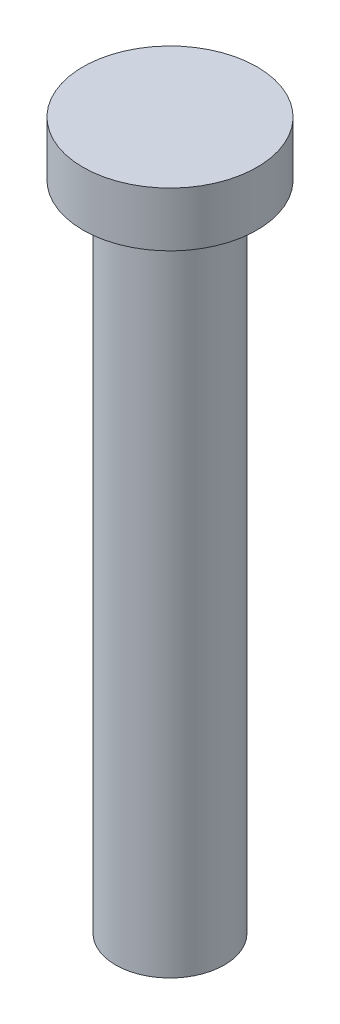
ISO-10303-21;
HEADER;
FILE_DESCRIPTION(('STEP AP214'),'2;1');
FILE_NAME('part.step','',(''),(''),'','','');
FILE_SCHEMA(('AUTOMOTIVE_DESIGN { 1 0 10303 214 1 1 1 1 }'));
ENDSEC;
DATA;
#1=APPLICATION_CONTEXT('core data for automotive mechanical design processes');
#2=APPLICATION_PROTOCOL_DEFINITION('international standard','automotive_design',2000,#1);
#3=PRODUCT_CONTEXT('',#1,'mechanical');
#4=PRODUCT('Part','Part','',(#3));
#5=PRODUCT_RELATED_PRODUCT_CATEGORY('part','',(#4));
#6=PRODUCT_DEFINITION_FORMATION('','',#4);
#7=PRODUCT_DEFINITION_CONTEXT('part definition',#1,'design');
#8=PRODUCT_DEFINITION('design','',#6,#7);
#9=PRODUCT_DEFINITION_SHAPE('','',#8);
#10=(LENGTH_UNIT() NAMED_UNIT(*) SI_UNIT(.MILLI.,.METRE.));
#11=(NAMED_UNIT(*) PLANE_ANGLE_UNIT() SI_UNIT($,.RADIAN.));
#12=(NAMED_UNIT(*) SI_UNIT($,.STERADIAN.) SOLID_ANGLE_UNIT());
#13=UNCERTAINTY_MEASURE_WITH_UNIT(LENGTH_MEASURE(1.E-05),#10,'distance_accuracy_value','');
#14=(GEOMETRIC_REPRESENTATION_CONTEXT(3) GLOBAL_UNCERTAINTY_ASSIGNED_CONTEXT((#13)) GLOBAL_UNIT_ASSIGNED_CONTEXT((#10,
#11,#12)) REPRESENTATION_CONTEXT('',''));
#15=CARTESIAN_POINT('',(0.,0.,0.));
#16=DIRECTION('',(0.,0.,1.));
#17=DIRECTION('',(1.,0.,0.));
#18=AXIS2_PLACEMENT_3D('',#15,#16,#17);
#19=CARTESIAN_POINT('',(0.,30.,0.));
#20=DIRECTION('',(0.,-1.,0.));
#21=DIRECTION('',(0.,0.,-1.));
#22=AXIS2_PLACEMENT_3D('',#19,#20,#21);
#23=CYLINDRICAL_SURFACE('',#22,2.5);
#24=CARTESIAN_POINT('',(0.,29.,0.));
#25=DIRECTION('',(0.,1.,0.));
#26=DIRECTION('',(0.,0.,1.));
#27=AXIS2_PLACEMENT_3D('',#24,#25,#26);
#28=CIRCLE('',#27,2.5);
#29=CARTESIAN_POINT('',(0.,29.,2.5));
#30=VERTEX_POINT('',#29);
#31=EDGE_CURVE('E10',#30,#30,#28,.F.);
#32=ORIENTED_EDGE('',*,*,#31,.T.);
#33=EDGE_LOOP('',(#32));
#34=FACE_BOUND('',#33,.T.);
#35=CARTESIAN_POINT('',(0.,0.,0.));
#36=DIRECTION('',(0.,1.,0.));
#37=DIRECTION('',(0.,0.,1.));
#38=AXIS2_PLACEMENT_3D('',#35,#36,#37);
#39=CIRCLE('',#38,2.5);
#40=CARTESIAN_POINT('',(0.,0.,2.5));
#41=VERTEX_POINT('',#40);
#42=EDGE_CURVE('E48',#41,#41,#39,.T.);
#43=ORIENTED_EDGE('',*,*,#42,.T.);
#44=EDGE_LOOP('',(#43));
#45=FACE_BOUND('',#44,.T.);
#46=ADVANCED_FACE('F36',(#34,#45),#23,.T.);
#47=CARTESIAN_POINT('',(0.,0.,0.));
#48=DIRECTION('',(0.,1.,0.));
#49=DIRECTION('',(0.,0.,1.));
#50=AXIS2_PLACEMENT_3D('',#47,#48,#49);
#51=PLANE('',#50);
#52=ORIENTED_EDGE('',*,*,#42,.F.);
#53=EDGE_LOOP('',(#52));
#54=FACE_BOUND('',#53,.T.);
#55=ADVANCED_FACE('F66',(#54),#51,.F.);
#56=CARTESIAN_POINT('',(0.,32.5,0.));
#57=DIRECTION('',(0.,-1.,0.));
#58=DIRECTION('',(0.,0.,-1.));
#59=AXIS2_PLACEMENT_3D('',#56,#57,#58);
#60=CYLINDRICAL_SURFACE('',#59,4.);
#61=CARTESIAN_POINT('',(0.,32.5,0.));
#62=DIRECTION('',(0.,1.,0.));
#63=DIRECTION('',(0.,0.,1.));
#64=AXIS2_PLACEMENT_3D('',#61,#62,#63);
#65=CIRCLE('',#64,4.);
#66=CARTESIAN_POINT('',(0.,32.5,4.));
#67=VERTEX_POINT('',#66);
#68=EDGE_CURVE('E52',#67,#67,#65,.T.);
#69=ORIENTED_EDGE('',*,*,#68,.F.);
#70=EDGE_LOOP('',(#69));
#71=FACE_BOUND('',#70,.T.);
#72=CARTESIAN_POINT('',(0.,30.,0.));
#73=DIRECTION('',(0.,1.,0.));
#74=DIRECTION('',(0.,0.,1.));
#75=AXIS2_PLACEMENT_3D('',#72,#73,#74);
#76=CIRCLE('',#75,4.);
#77=CARTESIAN_POINT('',(0.,30.,4.));
#78=VERTEX_POINT('',#77);
#79=EDGE_CURVE('E55',#78,#78,#76,.T.);
#80=ORIENTED_EDGE('',*,*,#79,.T.);
#81=EDGE_LOOP('',(#80));
#82=FACE_BOUND('',#81,.T.);
#83=ADVANCED_FACE('F63',(#71,#82),#60,.T.);
#84=CARTESIAN_POINT('',(0.,32.5,0.));
#85=DIRECTION('',(0.,1.,0.));
#86=DIRECTION('',(0.,0.,1.));
#87=AXIS2_PLACEMENT_3D('',#84,#85,#86);
#88=PLANE('',#87);
#89=ORIENTED_EDGE('',*,*,#68,.T.);
#90=EDGE_LOOP('',(#89));
#91=FACE_BOUND('',#90,.T.);
#92=ADVANCED_FACE('F61',(#91),#88,.T.);
#93=CARTESIAN_POINT('',(0.,30.,0.));
#94=DIRECTION('',(0.,1.,0.));
#95=DIRECTION('',(0.,0.,1.));
#96=AXIS2_PLACEMENT_3D('',#93,#94,#95);
#97=PLANE('',#96);
#98=CARTESIAN_POINT('',(0.,30.,0.));
#99=DIRECTION('',(0.,1.,0.));
#100=DIRECTION('',(0.,0.,1.));
#101=AXIS2_PLACEMENT_3D('',#98,#99,#100);
#102=CIRCLE('',#101,3.49999999999999);
#103=CARTESIAN_POINT('',(0.,30.,3.49999999999999));
#104=VERTEX_POINT('',#103);
#105=EDGE_CURVE('E44',#104,#104,#102,.T.);
#106=ORIENTED_EDGE('',*,*,#105,.T.);
#107=EDGE_LOOP('',(#106));
#108=FACE_BOUND('',#107,.T.);
#109=ORIENTED_EDGE('',*,*,#79,.F.);
#110=EDGE_LOOP('',(#109));
#111=FACE_BOUND('',#110,.T.);
#112=ADVANCED_FACE('F70',(#108,#111),#97,.F.);
#113=CARTESIAN_POINT('',(0.,30.,0.));
#114=DIRECTION('',(0.,1.,0.));
#115=DIRECTION('',(0.,0.,1.));
#116=AXIS2_PLACEMENT_3D('',#113,#114,#115);
#117=CONICAL_SURFACE('',#116,3.49999999999999,0.785398163397444);
#118=ORIENTED_EDGE('',*,*,#31,.F.);
#119=EDGE_LOOP('',(#118));
#120=FACE_BOUND('',#119,.T.);
#121=ORIENTED_EDGE('',*,*,#105,.F.);
#122=EDGE_LOOP('',(#121));
#123=FACE_BOUND('',#122,.T.);
#124=ADVANCED_FACE('F39',(#120,#123),#117,.T.);
#125=CLOSED_SHELL('',(#46,#55,#83,#92,#112,#124));
#126=MANIFOLD_SOLID_BREP('B2',#125);
#127=ADVANCED_BREP_SHAPE_REPRESENTATION('',(#18,#126),#14);
#128=SHAPE_DEFINITION_REPRESENTATION(#9,#127);
ENDSEC;
END-ISO-10303-21;
